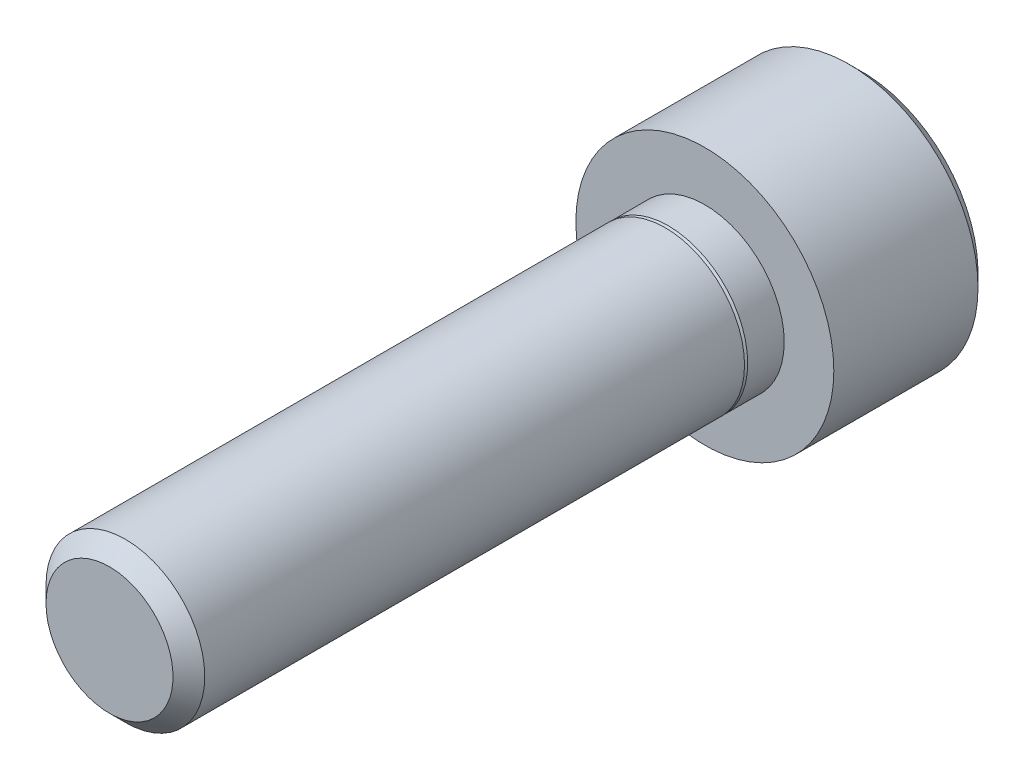
ISO-10303-21;
HEADER;
FILE_DESCRIPTION(('STEP AP214'),'2;1');
FILE_NAME('part.step','',(''),(''),'','','');
FILE_SCHEMA(('AUTOMOTIVE_DESIGN { 1 0 10303 214 1 1 1 1 }'));
ENDSEC;
DATA;
#1=APPLICATION_CONTEXT('core data for automotive mechanical design processes');
#2=APPLICATION_PROTOCOL_DEFINITION('international standard','automotive_design',2000,#1);
#3=PRODUCT_CONTEXT('',#1,'mechanical');
#4=PRODUCT('Part','Part','',(#3));
#5=PRODUCT_RELATED_PRODUCT_CATEGORY('part','',(#4));
#6=PRODUCT_DEFINITION_FORMATION('','',#4);
#7=PRODUCT_DEFINITION_CONTEXT('part definition',#1,'design');
#8=PRODUCT_DEFINITION('design','',#6,#7);
#9=PRODUCT_DEFINITION_SHAPE('','',#8);
#10=(LENGTH_UNIT() NAMED_UNIT(*) SI_UNIT(.MILLI.,.METRE.));
#11=(NAMED_UNIT(*) PLANE_ANGLE_UNIT() SI_UNIT($,.RADIAN.));
#12=(NAMED_UNIT(*) SI_UNIT($,.STERADIAN.) SOLID_ANGLE_UNIT());
#13=UNCERTAINTY_MEASURE_WITH_UNIT(LENGTH_MEASURE(1.E-05),#10,'distance_accuracy_value','');
#14=(GEOMETRIC_REPRESENTATION_CONTEXT(3) GLOBAL_UNCERTAINTY_ASSIGNED_CONTEXT((#13)) GLOBAL_UNIT_ASSIGNED_CONTEXT((#10,
#11,#12)) REPRESENTATION_CONTEXT('',''));
#15=CARTESIAN_POINT('',(0.,0.,0.));
#16=DIRECTION('',(0.,0.,1.));
#17=DIRECTION('',(1.,0.,0.));
#18=AXIS2_PLACEMENT_3D('',#15,#16,#17);
#19=CARTESIAN_POINT('',(0.,0.,-4.25));
#20=DIRECTION('',(0.,0.,1.));
#21=DIRECTION('',(1.,0.,0.));
#22=AXIS2_PLACEMENT_3D('',#19,#20,#21);
#23=PLANE('',#22);
#24=DIRECTION('',(0.866025403784439,0.499999999999999,0.));
#25=VECTOR('',#24,1.);
#26=CARTESIAN_POINT('',(3.,-1.73205080756888,-4.25));
#27=LINE('',#26,#25);
#28=CARTESIAN_POINT('',(3.,-1.73205080756888,-4.25));
#29=VERTEX_POINT('',#28);
#30=CARTESIAN_POINT('',(0.,-3.46410161513775,-4.25));
#31=VERTEX_POINT('',#30);
#32=EDGE_CURVE('E68',#29,#31,#27,.F.);
#33=ORIENTED_EDGE('',*,*,#32,.T.);
#34=DIRECTION('',(0.866025403784438,-0.5,0.));
#35=VECTOR('',#34,1.);
#36=CARTESIAN_POINT('',(0.,-3.46410161513775,-4.25));
#37=LINE('',#36,#35);
#38=CARTESIAN_POINT('',(-3.,-1.73205080756888,-4.25));
#39=VERTEX_POINT('',#38);
#40=EDGE_CURVE('E91',#31,#39,#37,.F.);
#41=ORIENTED_EDGE('',*,*,#40,.T.);
#42=DIRECTION('',(0.,1.,0.));
#43=VECTOR('',#42,1.);
#44=CARTESIAN_POINT('',(-3.,-1.73205080756888,-4.25));
#45=LINE('',#44,#43);
#46=CARTESIAN_POINT('',(-3.,1.73205080756888,-4.25));
#47=VERTEX_POINT('',#46);
#48=EDGE_CURVE('E138',#39,#47,#45,.T.);
#49=ORIENTED_EDGE('',*,*,#48,.T.);
#50=DIRECTION('',(-0.866025403784439,-0.5,0.));
#51=VECTOR('',#50,1.);
#52=CARTESIAN_POINT('',(-3.,1.73205080756888,-4.25));
#53=LINE('',#52,#51);
#54=CARTESIAN_POINT('',(0.,3.46410161513775,-4.25));
#55=VERTEX_POINT('',#54);
#56=EDGE_CURVE('E133',#47,#55,#53,.F.);
#57=ORIENTED_EDGE('',*,*,#56,.T.);
#58=DIRECTION('',(-0.866025403784439,0.5,0.));
#59=VECTOR('',#58,1.);
#60=CARTESIAN_POINT('',(0.,3.46410161513775,-4.25));
#61=LINE('',#60,#59);
#62=CARTESIAN_POINT('',(3.,1.73205080756888,-4.25));
#63=VERTEX_POINT('',#62);
#64=EDGE_CURVE('E74',#55,#63,#61,.F.);
#65=ORIENTED_EDGE('',*,*,#64,.T.);
#66=DIRECTION('',(0.,1.,0.));
#67=VECTOR('',#66,1.);
#68=CARTESIAN_POINT('',(3.,1.73205080756888,-4.25));
#69=LINE('',#68,#67);
#70=EDGE_CURVE('E71',#63,#29,#69,.F.);
#71=ORIENTED_EDGE('',*,*,#70,.T.);
#72=EDGE_LOOP('',(#33,#41,#49,#57,#65,#71));
#73=FACE_BOUND('',#72,.T.);
#74=ADVANCED_FACE('F17',(#73),#23,.F.);
#75=CARTESIAN_POINT('',(3.,1.73205080756888,-7.915));
#76=DIRECTION('',(1.,0.,0.));
#77=DIRECTION('',(0.,0.,-1.));
#78=AXIS2_PLACEMENT_3D('',#75,#76,#77);
#79=PLANE('',#78);
#80=DIRECTION('',(0.,0.,1.));
#81=VECTOR('',#80,1.);
#82=CARTESIAN_POINT('',(3.,1.73205080756887,-7.915));
#83=LINE('',#82,#81);
#84=CARTESIAN_POINT('',(3.,1.73205080756888,-7.915));
#85=VERTEX_POINT('',#84);
#86=EDGE_CURVE('E131',#63,#85,#83,.F.);
#87=ORIENTED_EDGE('',*,*,#86,.T.);
#88=DIRECTION('',(0.,1.,0.));
#89=VECTOR('',#88,1.);
#90=CARTESIAN_POINT('',(3.,0.,-7.915));
#91=LINE('',#90,#89);
#92=CARTESIAN_POINT('',(3.,-1.73205080756888,-7.915));
#93=VERTEX_POINT('',#92);
#94=EDGE_CURVE('E82',#85,#93,#91,.F.);
#95=ORIENTED_EDGE('',*,*,#94,.T.);
#96=DIRECTION('',(0.,0.,1.));
#97=VECTOR('',#96,1.);
#98=CARTESIAN_POINT('',(3.,-1.73205080756888,-7.915));
#99=LINE('',#98,#97);
#100=EDGE_CURVE('E77',#93,#29,#99,.T.);
#101=ORIENTED_EDGE('',*,*,#100,.T.);
#102=ORIENTED_EDGE('',*,*,#70,.F.);
#103=EDGE_LOOP('',(#87,#95,#101,#102));
#104=FACE_BOUND('',#103,.T.);
#105=ADVANCED_FACE('F80',(#104),#79,.F.);
#106=CARTESIAN_POINT('',(3.,-1.73205080756888,-7.915));
#107=DIRECTION('',(0.499999999999999,-0.866025403784439,0.));
#108=DIRECTION('',(0.866025403784439,0.499999999999999,0.));
#109=AXIS2_PLACEMENT_3D('',#106,#107,#108);
#110=PLANE('',#109);
#111=ORIENTED_EDGE('',*,*,#100,.F.);
#112=DIRECTION('',(-0.86602540378444,-0.499999999999998,0.));
#113=VECTOR('',#112,1.);
#114=CARTESIAN_POINT('',(3.,-1.73205080756888,-7.915));
#115=LINE('',#114,#113);
#116=CARTESIAN_POINT('',(0.,-3.46410161513775,-7.915));
#117=VERTEX_POINT('',#116);
#118=EDGE_CURVE('E125',#93,#117,#115,.T.);
#119=ORIENTED_EDGE('',*,*,#118,.T.);
#120=DIRECTION('',(0.,0.,1.));
#121=VECTOR('',#120,1.);
#122=CARTESIAN_POINT('',(0.,-3.46410161513775,-7.915));
#123=LINE('',#122,#121);
#124=EDGE_CURVE('E88',#117,#31,#123,.T.);
#125=ORIENTED_EDGE('',*,*,#124,.T.);
#126=ORIENTED_EDGE('',*,*,#32,.F.);
#127=EDGE_LOOP('',(#111,#119,#125,#126));
#128=FACE_BOUND('',#127,.T.);
#129=ADVANCED_FACE('F86',(#128),#110,.F.);
#130=CARTESIAN_POINT('',(0.,-3.46410161513775,-7.915));
#131=DIRECTION('',(-0.5,-0.866025403784438,0.));
#132=DIRECTION('',(0.866025403784438,-0.5,0.));
#133=AXIS2_PLACEMENT_3D('',#130,#131,#132);
#134=PLANE('',#133);
#135=ORIENTED_EDGE('',*,*,#124,.F.);
#136=DIRECTION('',(-0.866025403784439,0.499999999999999,0.));
#137=VECTOR('',#136,1.);
#138=CARTESIAN_POINT('',(0.,-3.46410161513775,-7.915));
#139=LINE('',#138,#137);
#140=CARTESIAN_POINT('',(-3.,-1.73205080756888,-7.915));
#141=VERTEX_POINT('',#140);
#142=EDGE_CURVE('E123',#117,#141,#139,.T.);
#143=ORIENTED_EDGE('',*,*,#142,.T.);
#144=DIRECTION('',(0.,0.,1.));
#145=VECTOR('',#144,1.);
#146=CARTESIAN_POINT('',(-3.,-1.73205080756888,-7.915));
#147=LINE('',#146,#145);
#148=EDGE_CURVE('E140',#141,#39,#147,.T.);
#149=ORIENTED_EDGE('',*,*,#148,.T.);
#150=ORIENTED_EDGE('',*,*,#40,.F.);
#151=EDGE_LOOP('',(#135,#143,#149,#150));
#152=FACE_BOUND('',#151,.T.);
#153=ADVANCED_FACE('F145',(#152),#134,.F.);
#154=CARTESIAN_POINT('',(-3.,-1.73205080756888,-7.915));
#155=DIRECTION('',(-1.,0.,0.));
#156=DIRECTION('',(0.,0.,1.));
#157=AXIS2_PLACEMENT_3D('',#154,#155,#156);
#158=PLANE('',#157);
#159=ORIENTED_EDGE('',*,*,#148,.F.);
#160=DIRECTION('',(0.,1.,0.));
#161=VECTOR('',#160,1.);
#162=CARTESIAN_POINT('',(-3.,0.,-7.915));
#163=LINE('',#162,#161);
#164=CARTESIAN_POINT('',(-3.,1.73205080756888,-7.915));
#165=VERTEX_POINT('',#164);
#166=EDGE_CURVE('E121',#141,#165,#163,.T.);
#167=ORIENTED_EDGE('',*,*,#166,.T.);
#168=DIRECTION('',(0.,0.,1.));
#169=VECTOR('',#168,1.);
#170=CARTESIAN_POINT('',(-3.,1.73205080756888,-7.915));
#171=LINE('',#170,#169);
#172=EDGE_CURVE('E135',#165,#47,#171,.T.);
#173=ORIENTED_EDGE('',*,*,#172,.T.);
#174=ORIENTED_EDGE('',*,*,#48,.F.);
#175=EDGE_LOOP('',(#159,#167,#173,#174));
#176=FACE_BOUND('',#175,.T.);
#177=ADVANCED_FACE('F149',(#176),#158,.F.);
#178=CARTESIAN_POINT('',(-3.,1.73205080756888,-7.915));
#179=DIRECTION('',(-0.5,0.866025403784439,0.));
#180=DIRECTION('',(-0.866025403784439,-0.5,0.));
#181=AXIS2_PLACEMENT_3D('',#178,#179,#180);
#182=PLANE('',#181);
#183=ORIENTED_EDGE('',*,*,#172,.F.);
#184=DIRECTION('',(0.86602540378444,0.499999999999998,0.));
#185=VECTOR('',#184,1.);
#186=CARTESIAN_POINT('',(-3.,1.73205080756888,-7.915));
#187=LINE('',#186,#185);
#188=CARTESIAN_POINT('',(0.,3.46410161513775,-7.915));
#189=VERTEX_POINT('',#188);
#190=EDGE_CURVE('E35',#165,#189,#187,.T.);
#191=ORIENTED_EDGE('',*,*,#190,.T.);
#192=DIRECTION('',(0.,0.,1.));
#193=VECTOR('',#192,1.);
#194=CARTESIAN_POINT('',(0.,3.46410161513775,-7.915));
#195=LINE('',#194,#193);
#196=EDGE_CURVE('E129',#189,#55,#195,.T.);
#197=ORIENTED_EDGE('',*,*,#196,.T.);
#198=ORIENTED_EDGE('',*,*,#56,.F.);
#199=EDGE_LOOP('',(#183,#191,#197,#198));
#200=FACE_BOUND('',#199,.T.);
#201=ADVANCED_FACE('F151',(#200),#182,.F.);
#202=CARTESIAN_POINT('',(0.,3.46410161513775,-7.915));
#203=DIRECTION('',(0.5,0.866025403784439,0.));
#204=DIRECTION('',(-0.866025403784439,0.5,0.));
#205=AXIS2_PLACEMENT_3D('',#202,#203,#204);
#206=PLANE('',#205);
#207=ORIENTED_EDGE('',*,*,#196,.F.);
#208=DIRECTION('',(0.86602540378444,-0.499999999999998,0.));
#209=VECTOR('',#208,1.);
#210=CARTESIAN_POINT('',(0.,3.46410161513775,-7.915));
#211=LINE('',#210,#209);
#212=EDGE_CURVE('E114',#189,#85,#211,.T.);
#213=ORIENTED_EDGE('',*,*,#212,.T.);
#214=ORIENTED_EDGE('',*,*,#86,.F.);
#215=ORIENTED_EDGE('',*,*,#64,.F.);
#216=EDGE_LOOP('',(#207,#213,#214,#215));
#217=FACE_BOUND('',#216,.T.);
#218=ADVANCED_FACE('F154',(#217),#206,.F.);
#219=CARTESIAN_POINT('',(0.,0.,-7.915));
#220=DIRECTION('',(0.,0.,1.));
#221=DIRECTION('',(1.,0.,0.));
#222=AXIS2_PLACEMENT_3D('',#219,#220,#221);
#223=PLANE('',#222);
#224=ORIENTED_EDGE('',*,*,#190,.F.);
#225=ORIENTED_EDGE('',*,*,#166,.F.);
#226=ORIENTED_EDGE('',*,*,#142,.F.);
#227=ORIENTED_EDGE('',*,*,#118,.F.);
#228=ORIENTED_EDGE('',*,*,#94,.F.);
#229=ORIENTED_EDGE('',*,*,#212,.F.);
#230=EDGE_LOOP('',(#224,#225,#226,#227,#228,#229));
#231=FACE_BOUND('',#230,.T.);
#232=CARTESIAN_POINT('',(0.,0.,-7.91499999996859));
#233=DIRECTION('',(0.,0.,1.));
#234=DIRECTION('',(0.,-1.,0.));
#235=AXIS2_PLACEMENT_3D('',#232,#233,#234);
#236=CIRCLE('',#235,5.85000000012315);
#237=CARTESIAN_POINT('',(0.,-5.85000000012315,-7.91499999996859));
#238=VERTEX_POINT('',#237);
#239=EDGE_CURVE('E20',#238,#238,#236,.T.);
#240=ORIENTED_EDGE('',*,*,#239,.F.);
#241=EDGE_LOOP('',(#240));
#242=FACE_BOUND('',#241,.T.);
#243=ADVANCED_FACE('F156',(#231,#242),#223,.F.);
#244=CARTESIAN_POINT('',(0.,0.,-7.26500000013175));
#245=DIRECTION('',(0.,0.,1.));
#246=DIRECTION('',(0.,-1.,0.));
#247=AXIS2_PLACEMENT_3D('',#244,#245,#246);
#248=CONICAL_SURFACE('',#247,6.49999999995998,0.785398163397448);
#249=ORIENTED_EDGE('',*,*,#239,.T.);
#250=EDGE_LOOP('',(#249));
#251=FACE_BOUND('',#250,.T.);
#252=CARTESIAN_POINT('',(0.,0.,-7.265));
#253=DIRECTION('',(0.,0.,1.));
#254=DIRECTION('',(1.,0.,0.));
#255=AXIS2_PLACEMENT_3D('',#252,#253,#254);
#256=CIRCLE('',#255,6.5);
#257=CARTESIAN_POINT('',(6.5,0.,-7.265));
#258=VERTEX_POINT('',#257);
#259=EDGE_CURVE('E106',#258,#258,#256,.T.);
#260=ORIENTED_EDGE('',*,*,#259,.F.);
#261=EDGE_LOOP('',(#260));
#262=FACE_BOUND('',#261,.T.);
#263=ADVANCED_FACE('F159',(#251,#262),#248,.T.);
#264=CARTESIAN_POINT('',(0.,0.,-7.915));
#265=DIRECTION('',(0.,0.,1.));
#266=DIRECTION('',(1.,0.,0.));
#267=AXIS2_PLACEMENT_3D('',#264,#265,#266);
#268=CYLINDRICAL_SURFACE('',#267,6.5);
#269=ORIENTED_EDGE('',*,*,#259,.T.);
#270=EDGE_LOOP('',(#269));
#271=FACE_BOUND('',#270,.T.);
#272=CARTESIAN_POINT('',(0.,0.,0.));
#273=DIRECTION('',(0.,0.,1.));
#274=DIRECTION('',(1.,0.,0.));
#275=AXIS2_PLACEMENT_3D('',#272,#273,#274);
#276=CIRCLE('',#275,6.5);
#277=CARTESIAN_POINT('',(6.5,0.,0.));
#278=VERTEX_POINT('',#277);
#279=EDGE_CURVE('E104',#278,#278,#276,.T.);
#280=ORIENTED_EDGE('',*,*,#279,.F.);
#281=EDGE_LOOP('',(#280));
#282=FACE_BOUND('',#281,.T.);
#283=ADVANCED_FACE('F165',(#271,#282),#268,.T.);
#284=CARTESIAN_POINT('',(0.,0.,0.));
#285=DIRECTION('',(0.,0.,1.));
#286=DIRECTION('',(1.,0.,0.));
#287=AXIS2_PLACEMENT_3D('',#284,#285,#286);
#288=PLANE('',#287);
#289=CARTESIAN_POINT('',(0.,0.,0.));
#290=DIRECTION('',(0.,0.,1.));
#291=DIRECTION('',(1.,0.,0.));
#292=AXIS2_PLACEMENT_3D('',#289,#290,#291);
#293=CIRCLE('',#292,4.);
#294=CARTESIAN_POINT('',(4.,0.,0.));
#295=VERTEX_POINT('',#294);
#296=EDGE_CURVE('E102',#295,#295,#293,.T.);
#297=ORIENTED_EDGE('',*,*,#296,.F.);
#298=EDGE_LOOP('',(#297));
#299=FACE_BOUND('',#298,.T.);
#300=ORIENTED_EDGE('',*,*,#279,.T.);
#301=EDGE_LOOP('',(#300));
#302=FACE_BOUND('',#301,.T.);
#303=ADVANCED_FACE('F171',(#299,#302),#288,.T.);
#304=CARTESIAN_POINT('',(0.,0.,-4.25));
#305=DIRECTION('',(0.,0.,1.));
#306=DIRECTION('',(1.,0.,0.));
#307=AXIS2_PLACEMENT_3D('',#304,#305,#306);
#308=CYLINDRICAL_SURFACE('',#307,4.);
#309=ORIENTED_EDGE('',*,*,#296,.T.);
#310=EDGE_LOOP('',(#309));
#311=FACE_BOUND('',#310,.T.);
#312=CARTESIAN_POINT('',(0.,0.,1.84000000007245));
#313=DIRECTION('',(0.,0.,-1.));
#314=DIRECTION('',(-1.,0.,0.));
#315=AXIS2_PLACEMENT_3D('',#312,#313,#314);
#316=CIRCLE('',#315,3.99999999996226);
#317=CARTESIAN_POINT('',(-3.99999999996226,0.,1.84000000007245));
#318=VERTEX_POINT('',#317);
#319=EDGE_CURVE('E101',#318,#318,#316,.F.);
#320=ORIENTED_EDGE('',*,*,#319,.F.);
#321=EDGE_LOOP('',(#320));
#322=FACE_BOUND('',#321,.T.);
#323=ADVANCED_FACE('F196',(#311,#322),#308,.T.);
#324=CARTESIAN_POINT('',(0.,0.,30.));
#325=DIRECTION('',(0.,0.,1.));
#326=DIRECTION('',(1.,0.,0.));
#327=AXIS2_PLACEMENT_3D('',#324,#325,#326);
#328=PLANE('',#327);
#329=CARTESIAN_POINT('',(0.,0.,29.9999999999159));
#330=DIRECTION('',(0.,0.,-1.));
#331=DIRECTION('',(-1.,0.,0.));
#332=AXIS2_PLACEMENT_3D('',#329,#330,#331);
#333=CIRCLE('',#332,3.1999999999357);
#334=CARTESIAN_POINT('',(-3.1999999999357,0.,29.9999999999159));
#335=VERTEX_POINT('',#334);
#336=EDGE_CURVE('E98',#335,#335,#333,.T.);
#337=ORIENTED_EDGE('',*,*,#336,.F.);
#338=EDGE_LOOP('',(#337));
#339=FACE_BOUND('',#338,.T.);
#340=ADVANCED_FACE('F192',(#339),#328,.T.);
#341=CARTESIAN_POINT('',(0.,0.,1.84000000007245));
#342=DIRECTION('',(0.,0.,-1.));
#343=DIRECTION('',(-1.,0.,0.));
#344=AXIS2_PLACEMENT_3D('',#341,#342,#343);
#345=CONICAL_SURFACE('',#344,3.99999999996226,0.785398163397448);
#346=ORIENTED_EDGE('',*,*,#319,.T.);
#347=EDGE_LOOP('',(#346));
#348=FACE_BOUND('',#347,.T.);
#349=CARTESIAN_POINT('',(0.,0.,2.00000000000955));
#350=DIRECTION('',(0.,0.,-1.));
#351=DIRECTION('',(-1.,0.,0.));
#352=AXIS2_PLACEMENT_3D('',#349,#350,#351);
#353=CIRCLE('',#352,3.84000000002516);
#354=CARTESIAN_POINT('',(-3.84000000002516,0.,2.00000000000955));
#355=VERTEX_POINT('',#354);
#356=EDGE_CURVE('E95',#355,#355,#353,.T.);
#357=ORIENTED_EDGE('',*,*,#356,.T.);
#358=EDGE_LOOP('',(#357));
#359=FACE_BOUND('',#358,.T.);
#360=ADVANCED_FACE('F188',(#348,#359),#345,.T.);
#361=CARTESIAN_POINT('',(0.,0.,29.2000000000598));
#362=DIRECTION('',(0.,0.,-1.));
#363=DIRECTION('',(-1.,0.,0.));
#364=AXIS2_PLACEMENT_3D('',#361,#362,#363);
#365=CONICAL_SURFACE('',#364,3.99999999984857,0.785398163432975);
#366=CARTESIAN_POINT('',(0.,0.,29.2));
#367=DIRECTION('',(0.,0.,1.));
#368=DIRECTION('',(1.,0.,0.));
#369=AXIS2_PLACEMENT_3D('',#366,#367,#368);
#370=CIRCLE('',#369,4.);
#371=CARTESIAN_POINT('',(4.,0.,29.2));
#372=VERTEX_POINT('',#371);
#373=EDGE_CURVE('E26',#372,#372,#370,.F.);
#374=ORIENTED_EDGE('',*,*,#373,.F.);
#375=EDGE_LOOP('',(#374));
#376=FACE_BOUND('',#375,.T.);
#377=ORIENTED_EDGE('',*,*,#336,.T.);
#378=EDGE_LOOP('',(#377));
#379=FACE_BOUND('',#378,.T.);
#380=ADVANCED_FACE('F181',(#376,#379),#365,.T.);
#381=CARTESIAN_POINT('',(0.,0.,2.));
#382=DIRECTION('',(0.,0.,1.));
#383=DIRECTION('',(1.,0.,0.));
#384=AXIS2_PLACEMENT_3D('',#381,#382,#383);
#385=PLANE('',#384);
#386=ORIENTED_EDGE('',*,*,#356,.F.);
#387=EDGE_LOOP('',(#386));
#388=FACE_BOUND('',#387,.T.);
#389=CARTESIAN_POINT('',(0.,0.,2.));
#390=DIRECTION('',(0.,0.,1.));
#391=DIRECTION('',(1.,0.,0.));
#392=AXIS2_PLACEMENT_3D('',#389,#390,#391);
#393=CIRCLE('',#392,4.);
#394=CARTESIAN_POINT('',(4.,0.,2.));
#395=VERTEX_POINT('',#394);
#396=EDGE_CURVE('E11',#395,#395,#393,.T.);
#397=ORIENTED_EDGE('',*,*,#396,.F.);
#398=EDGE_LOOP('',(#397));
#399=FACE_BOUND('',#398,.T.);
#400=ADVANCED_FACE('F175',(#388,#399),#385,.F.);
#401=CARTESIAN_POINT('',(0.,0.,2.));
#402=DIRECTION('',(0.,0.,1.));
#403=DIRECTION('',(1.,0.,0.));
#404=AXIS2_PLACEMENT_3D('',#401,#402,#403);
#405=CYLINDRICAL_SURFACE('',#404,4.);
#406=ORIENTED_EDGE('',*,*,#396,.T.);
#407=EDGE_LOOP('',(#406));
#408=FACE_BOUND('',#407,.T.);
#409=ORIENTED_EDGE('',*,*,#373,.T.);
#410=EDGE_LOOP('',(#409));
#411=FACE_BOUND('',#410,.T.);
#412=ADVANCED_FACE('F173',(#408,#411),#405,.T.);
#413=CLOSED_SHELL('',(#74,#105,#129,#153,#177,#201,#218,#243,#263,#283,#303,#323,#340,#360,#380,
#400,#412));
#414=MANIFOLD_SOLID_BREP('B1',#413);
#415=ADVANCED_BREP_SHAPE_REPRESENTATION('',(#18,#414),#14);
#416=SHAPE_DEFINITION_REPRESENTATION(#9,#415);
ENDSEC;
END-ISO-10303-21;
